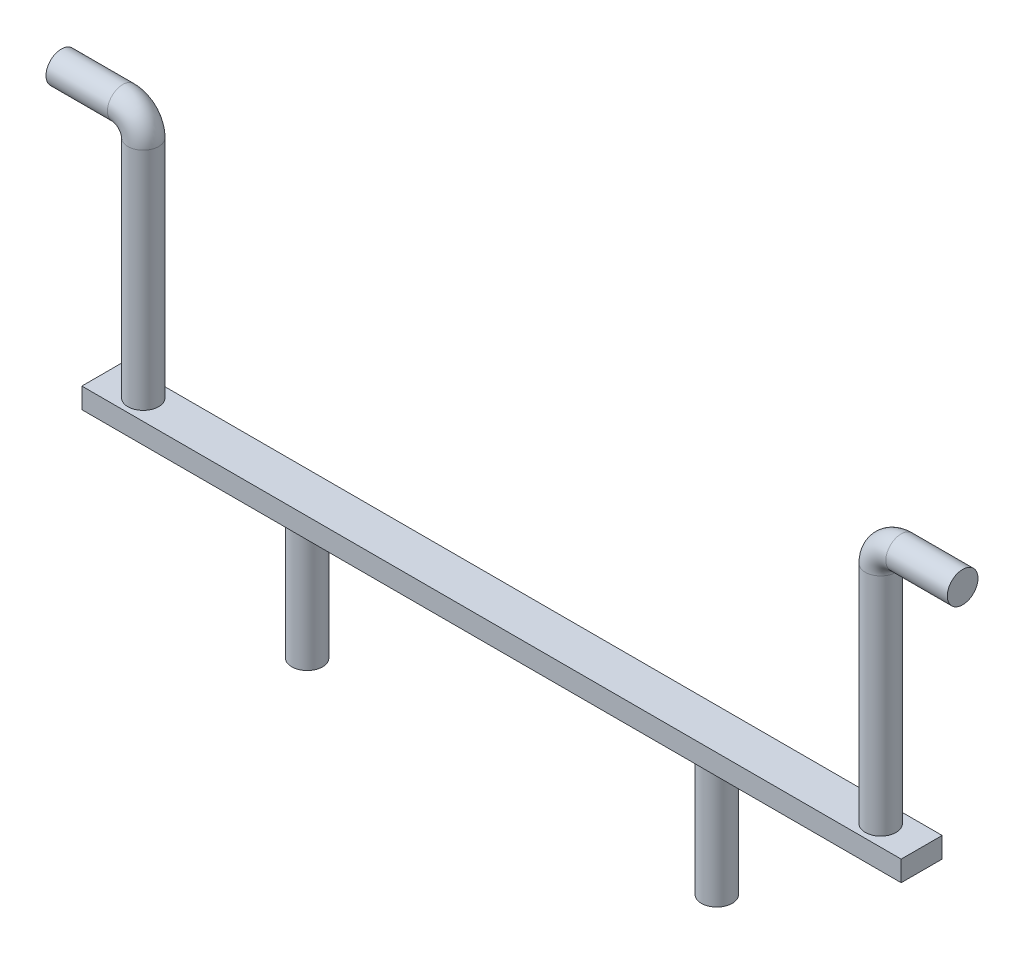
ISO-10303-21;
HEADER;
FILE_DESCRIPTION(('STEP AP214'),'2;1');
FILE_NAME('part.step','',(''),(''),'','','');
FILE_SCHEMA(('AUTOMOTIVE_DESIGN { 1 0 10303 214 1 1 1 1 }'));
ENDSEC;
DATA;
#1=APPLICATION_CONTEXT('core data for automotive mechanical design processes');
#2=APPLICATION_PROTOCOL_DEFINITION('international standard','automotive_design',2000,#1);
#3=PRODUCT_CONTEXT('',#1,'mechanical');
#4=PRODUCT('Part','Part','',(#3));
#5=PRODUCT_RELATED_PRODUCT_CATEGORY('part','',(#4));
#6=PRODUCT_DEFINITION_FORMATION('','',#4);
#7=PRODUCT_DEFINITION_CONTEXT('part definition',#1,'design');
#8=PRODUCT_DEFINITION('design','',#6,#7);
#9=PRODUCT_DEFINITION_SHAPE('','',#8);
#10=(LENGTH_UNIT() NAMED_UNIT(*) SI_UNIT(.MILLI.,.METRE.));
#11=(NAMED_UNIT(*) PLANE_ANGLE_UNIT() SI_UNIT($,.RADIAN.));
#12=(NAMED_UNIT(*) SI_UNIT($,.STERADIAN.) SOLID_ANGLE_UNIT());
#13=UNCERTAINTY_MEASURE_WITH_UNIT(LENGTH_MEASURE(1.E-05),#10,'distance_accuracy_value','');
#14=(GEOMETRIC_REPRESENTATION_CONTEXT(3) GLOBAL_UNCERTAINTY_ASSIGNED_CONTEXT((#13)) GLOBAL_UNIT_ASSIGNED_CONTEXT((#10,
#11,#12)) REPRESENTATION_CONTEXT('',''));
#15=CARTESIAN_POINT('',(0.,0.,0.));
#16=DIRECTION('',(0.,0.,1.));
#17=DIRECTION('',(1.,0.,0.));
#18=AXIS2_PLACEMENT_3D('',#15,#16,#17);
#19=CARTESIAN_POINT('',(254.,12.7,-12.7));
#20=DIRECTION('',(-1.,0.,0.));
#21=DIRECTION('',(0.,0.,1.));
#22=AXIS2_PLACEMENT_3D('',#19,#20,#21);
#23=PLANE('',#22);
#24=DIRECTION('',(0.,0.,-1.));
#25=VECTOR('',#24,1.);
#26=CARTESIAN_POINT('',(254.,0.,-12.7));
#27=LINE('',#26,#25);
#28=CARTESIAN_POINT('',(254.,0.,12.7));
#29=VERTEX_POINT('',#28);
#30=CARTESIAN_POINT('',(254.,0.,-12.7));
#31=VERTEX_POINT('',#30);
#32=EDGE_CURVE('E135',#29,#31,#27,.T.);
#33=ORIENTED_EDGE('',*,*,#32,.T.);
#34=DIRECTION('',(0.,-1.,0.));
#35=VECTOR('',#34,1.);
#36=CARTESIAN_POINT('',(254.,12.7,-12.7));
#37=LINE('',#36,#35);
#38=CARTESIAN_POINT('',(254.,12.7,-12.7));
#39=VERTEX_POINT('',#38);
#40=EDGE_CURVE('E124',#39,#31,#37,.T.);
#41=ORIENTED_EDGE('',*,*,#40,.F.);
#42=DIRECTION('',(0.,0.,-1.));
#43=VECTOR('',#42,1.);
#44=CARTESIAN_POINT('',(254.,12.7,-12.7));
#45=LINE('',#44,#43);
#46=CARTESIAN_POINT('',(254.,12.7,12.7));
#47=VERTEX_POINT('',#46);
#48=EDGE_CURVE('E116',#47,#39,#45,.T.);
#49=ORIENTED_EDGE('',*,*,#48,.F.);
#50=DIRECTION('',(0.,-1.,0.));
#51=VECTOR('',#50,1.);
#52=CARTESIAN_POINT('',(254.,12.7,12.7));
#53=LINE('',#52,#51);
#54=EDGE_CURVE('E131',#47,#29,#53,.T.);
#55=ORIENTED_EDGE('',*,*,#54,.T.);
#56=EDGE_LOOP('',(#33,#41,#49,#55));
#57=FACE_BOUND('',#56,.T.);
#58=ADVANCED_FACE('F63',(#57),#23,.F.);
#59=CARTESIAN_POINT('',(-254.,12.7,-12.7));
#60=DIRECTION('',(0.,0.,1.));
#61=DIRECTION('',(1.,0.,0.));
#62=AXIS2_PLACEMENT_3D('',#59,#60,#61);
#63=PLANE('',#62);
#64=DIRECTION('',(-1.,0.,0.));
#65=VECTOR('',#64,1.);
#66=CARTESIAN_POINT('',(-254.,0.,-12.7));
#67=LINE('',#66,#65);
#68=CARTESIAN_POINT('',(-254.,0.,-12.7));
#69=VERTEX_POINT('',#68);
#70=EDGE_CURVE('E122',#31,#69,#67,.T.);
#71=ORIENTED_EDGE('',*,*,#70,.T.);
#72=DIRECTION('',(0.,-1.,0.));
#73=VECTOR('',#72,1.);
#74=CARTESIAN_POINT('',(-254.,12.7,-12.7));
#75=LINE('',#74,#73);
#76=CARTESIAN_POINT('',(-254.,12.7,-12.7));
#77=VERTEX_POINT('',#76);
#78=EDGE_CURVE('E120',#77,#69,#75,.T.);
#79=ORIENTED_EDGE('',*,*,#78,.F.);
#80=DIRECTION('',(-1.,0.,0.));
#81=VECTOR('',#80,1.);
#82=CARTESIAN_POINT('',(-254.,12.7,-12.7));
#83=LINE('',#82,#81);
#84=EDGE_CURVE('E111',#39,#77,#83,.T.);
#85=ORIENTED_EDGE('',*,*,#84,.F.);
#86=ORIENTED_EDGE('',*,*,#40,.T.);
#87=EDGE_LOOP('',(#71,#79,#85,#86));
#88=FACE_BOUND('',#87,.T.);
#89=ADVANCED_FACE('F121',(#88),#63,.F.);
#90=CARTESIAN_POINT('',(-254.,12.7,-12.7));
#91=DIRECTION('',(1.,0.,0.));
#92=DIRECTION('',(0.,0.,-1.));
#93=AXIS2_PLACEMENT_3D('',#90,#91,#92);
#94=PLANE('',#93);
#95=DIRECTION('',(0.,0.,1.));
#96=VECTOR('',#95,1.);
#97=CARTESIAN_POINT('',(-254.,0.,-12.7));
#98=LINE('',#97,#96);
#99=CARTESIAN_POINT('',(-254.,0.,12.7));
#100=VERTEX_POINT('',#99);
#101=EDGE_CURVE('E97',#69,#100,#98,.T.);
#102=ORIENTED_EDGE('',*,*,#101,.T.);
#103=DIRECTION('',(0.,-1.,0.));
#104=VECTOR('',#103,1.);
#105=CARTESIAN_POINT('',(-254.,12.7,12.7));
#106=LINE('',#105,#104);
#107=CARTESIAN_POINT('',(-254.,12.7,12.7));
#108=VERTEX_POINT('',#107);
#109=EDGE_CURVE('E125',#108,#100,#106,.T.);
#110=ORIENTED_EDGE('',*,*,#109,.F.);
#111=DIRECTION('',(0.,0.,1.));
#112=VECTOR('',#111,1.);
#113=CARTESIAN_POINT('',(-254.,12.7,-12.7));
#114=LINE('',#113,#112);
#115=EDGE_CURVE('E114',#77,#108,#114,.T.);
#116=ORIENTED_EDGE('',*,*,#115,.F.);
#117=ORIENTED_EDGE('',*,*,#78,.T.);
#118=EDGE_LOOP('',(#102,#110,#116,#117));
#119=FACE_BOUND('',#118,.T.);
#120=ADVANCED_FACE('F127',(#119),#94,.F.);
#121=CARTESIAN_POINT('',(-254.,12.7,12.7));
#122=DIRECTION('',(0.,0.,-1.));
#123=DIRECTION('',(-1.,0.,0.));
#124=AXIS2_PLACEMENT_3D('',#121,#122,#123);
#125=PLANE('',#124);
#126=DIRECTION('',(1.,0.,0.));
#127=VECTOR('',#126,1.);
#128=CARTESIAN_POINT('',(-254.,0.,12.7));
#129=LINE('',#128,#127);
#130=EDGE_CURVE('E103',#100,#29,#129,.T.);
#131=ORIENTED_EDGE('',*,*,#130,.T.);
#132=ORIENTED_EDGE('',*,*,#54,.F.);
#133=DIRECTION('',(1.,0.,0.));
#134=VECTOR('',#133,1.);
#135=CARTESIAN_POINT('',(-254.,12.7,12.7));
#136=LINE('',#135,#134);
#137=EDGE_CURVE('E80',#108,#47,#136,.T.);
#138=ORIENTED_EDGE('',*,*,#137,.F.);
#139=ORIENTED_EDGE('',*,*,#109,.T.);
#140=EDGE_LOOP('',(#131,#132,#138,#139));
#141=FACE_BOUND('',#140,.T.);
#142=ADVANCED_FACE('F164',(#141),#125,.F.);
#143=CARTESIAN_POINT('',(0.,12.7,0.));
#144=DIRECTION('',(0.,1.,0.));
#145=DIRECTION('',(0.,0.,1.));
#146=AXIS2_PLACEMENT_3D('',#143,#144,#145);
#147=PLANE('',#146);
#148=CARTESIAN_POINT('',(228.6,12.7,0.));
#149=DIRECTION('',(0.,1.,0.));
#150=DIRECTION('',(0.,0.,-1.));
#151=AXIS2_PLACEMENT_3D('',#148,#149,#150);
#152=CIRCLE('',#151,9.525);
#153=CARTESIAN_POINT('',(228.6,12.7,-9.525));
#154=VERTEX_POINT('',#153);
#155=EDGE_CURVE('E338',#154,#154,#152,.F.);
#156=ORIENTED_EDGE('',*,*,#155,.T.);
#157=EDGE_LOOP('',(#156));
#158=FACE_BOUND('',#157,.T.);
#159=CARTESIAN_POINT('',(-228.6,12.7,0.));
#160=DIRECTION('',(0.,-1.,0.));
#161=DIRECTION('',(0.,0.,-1.));
#162=AXIS2_PLACEMENT_3D('',#159,#160,#161);
#163=CIRCLE('',#162,9.525);
#164=CARTESIAN_POINT('',(-228.6,12.7,-9.525));
#165=VERTEX_POINT('',#164);
#166=EDGE_CURVE('E335',#165,#165,#163,.T.);
#167=ORIENTED_EDGE('',*,*,#166,.T.);
#168=EDGE_LOOP('',(#167));
#169=FACE_BOUND('',#168,.T.);
#170=ORIENTED_EDGE('',*,*,#48,.T.);
#171=ORIENTED_EDGE('',*,*,#84,.T.);
#172=ORIENTED_EDGE('',*,*,#115,.T.);
#173=ORIENTED_EDGE('',*,*,#137,.T.);
#174=EDGE_LOOP('',(#170,#171,#172,#173));
#175=FACE_BOUND('',#174,.T.);
#176=ADVANCED_FACE('F112',(#158,#169,#175),#147,.T.);
#177=CARTESIAN_POINT('',(0.,0.,0.));
#178=DIRECTION('',(0.,1.,0.));
#179=DIRECTION('',(0.,0.,1.));
#180=AXIS2_PLACEMENT_3D('',#177,#178,#179);
#181=PLANE('',#180);
#182=CARTESIAN_POINT('',(127.,0.,0.));
#183=DIRECTION('',(0.,1.,0.));
#184=DIRECTION('',(0.,0.,1.));
#185=AXIS2_PLACEMENT_3D('',#182,#183,#184);
#186=CIRCLE('',#185,9.52500000000001);
#187=CARTESIAN_POINT('',(127.,0.,9.52500000000001));
#188=VERTEX_POINT('',#187);
#189=EDGE_CURVE('E12',#188,#188,#186,.F.);
#190=ORIENTED_EDGE('',*,*,#189,.F.);
#191=EDGE_LOOP('',(#190));
#192=FACE_BOUND('',#191,.T.);
#193=CARTESIAN_POINT('',(-127.,0.,0.));
#194=DIRECTION('',(0.,1.,0.));
#195=DIRECTION('',(0.,0.,1.));
#196=AXIS2_PLACEMENT_3D('',#193,#194,#195);
#197=CIRCLE('',#196,9.52500000000001);
#198=CARTESIAN_POINT('',(-127.,0.,9.52500000000001));
#199=VERTEX_POINT('',#198);
#200=EDGE_CURVE('E72',#199,#199,#197,.F.);
#201=ORIENTED_EDGE('',*,*,#200,.F.);
#202=EDGE_LOOP('',(#201));
#203=FACE_BOUND('',#202,.T.);
#204=ORIENTED_EDGE('',*,*,#32,.F.);
#205=ORIENTED_EDGE('',*,*,#130,.F.);
#206=ORIENTED_EDGE('',*,*,#101,.F.);
#207=ORIENTED_EDGE('',*,*,#70,.F.);
#208=EDGE_LOOP('',(#204,#205,#206,#207));
#209=FACE_BOUND('',#208,.T.);
#210=ADVANCED_FACE('F157',(#192,#203,#209),#181,.F.);
#211=CARTESIAN_POINT('',(-127.,-76.2,0.));
#212=DIRECTION('',(0.,1.,0.));
#213=DIRECTION('',(0.,0.,1.));
#214=AXIS2_PLACEMENT_3D('',#211,#212,#213);
#215=CYLINDRICAL_SURFACE('',#214,9.52500000000001);
#216=CARTESIAN_POINT('',(-127.,-76.2,0.));
#217=DIRECTION('',(0.,-1.,0.));
#218=DIRECTION('',(0.,0.,-1.));
#219=AXIS2_PLACEMENT_3D('',#216,#217,#218);
#220=CIRCLE('',#219,9.52500000000001);
#221=CARTESIAN_POINT('',(-127.,-76.2,9.52500000000001));
#222=VERTEX_POINT('',#221);
#223=EDGE_CURVE('E139',#222,#222,#220,.T.);
#224=CARTESIAN_POINT('',(-127.,-76.2,9.52500000000001));
#225=CARTESIAN_POINT('',(-127.,-75.40625,9.52500000000001));
#226=CARTESIAN_POINT('',(-127.,-74.6125,9.52500000000001));
#227=CARTESIAN_POINT('',(-127.,-73.025,9.52500000000001));
#228=CARTESIAN_POINT('',(-127.,-72.23125,9.52500000000001));
#229=CARTESIAN_POINT('',(-127.,-70.64375,9.52500000000001));
#230=CARTESIAN_POINT('',(-127.,-69.85,9.52500000000001));
#231=CARTESIAN_POINT('',(-127.,-68.2625,9.52500000000001));
#232=CARTESIAN_POINT('',(-127.,-67.46875,9.52500000000001));
#233=CARTESIAN_POINT('',(-127.,-65.88125,9.52500000000001));
#234=CARTESIAN_POINT('',(-127.,-65.0875,9.52500000000001));
#235=CARTESIAN_POINT('',(-127.,-63.5,9.52500000000001));
#236=CARTESIAN_POINT('',(-127.,-62.70625,9.52500000000001));
#237=CARTESIAN_POINT('',(-127.,-61.11875,9.52500000000001));
#238=CARTESIAN_POINT('',(-127.,-60.325,9.52500000000001));
#239=CARTESIAN_POINT('',(-127.,-58.7375,9.52500000000001));
#240=CARTESIAN_POINT('',(-127.,-57.94375,9.52500000000001));
#241=CARTESIAN_POINT('',(-127.,-56.35625,9.52500000000001));
#242=CARTESIAN_POINT('',(-127.,-55.5625,9.52500000000001));
#243=CARTESIAN_POINT('',(-127.,-53.975,9.52500000000001));
#244=CARTESIAN_POINT('',(-127.,-53.18125,9.52500000000001));
#245=CARTESIAN_POINT('',(-127.,-51.59375,9.52500000000001));
#246=CARTESIAN_POINT('',(-127.,-50.8,9.52500000000001));
#247=CARTESIAN_POINT('',(-127.,-49.2125,9.52500000000001));
#248=CARTESIAN_POINT('',(-127.,-48.41875,9.52500000000001));
#249=CARTESIAN_POINT('',(-127.,-46.83125,9.52500000000001));
#250=CARTESIAN_POINT('',(-127.,-46.0375,9.52500000000001));
#251=CARTESIAN_POINT('',(-127.,-44.45,9.52500000000001));
#252=CARTESIAN_POINT('',(-127.,-43.65625,9.52500000000001));
#253=CARTESIAN_POINT('',(-127.,-42.06875,9.52500000000001));
#254=CARTESIAN_POINT('',(-127.,-41.275,9.52500000000001));
#255=CARTESIAN_POINT('',(-127.,-39.6875,9.52500000000001));
#256=CARTESIAN_POINT('',(-127.,-38.89375,9.52500000000001));
#257=CARTESIAN_POINT('',(-127.,-37.30625,9.52500000000001));
#258=CARTESIAN_POINT('',(-127.,-36.5125,9.52500000000001));
#259=CARTESIAN_POINT('',(-127.,-34.925,9.52500000000001));
#260=CARTESIAN_POINT('',(-127.,-34.13125,9.52500000000001));
#261=CARTESIAN_POINT('',(-127.,-32.54375,9.52500000000001));
#262=CARTESIAN_POINT('',(-127.,-31.75,9.52500000000001));
#263=CARTESIAN_POINT('',(-127.,-30.1625,9.52500000000001));
#264=CARTESIAN_POINT('',(-127.,-29.36875,9.52500000000001));
#265=CARTESIAN_POINT('',(-127.,-27.78125,9.52500000000001));
#266=CARTESIAN_POINT('',(-127.,-26.9875,9.52500000000001));
#267=CARTESIAN_POINT('',(-127.,-25.4,9.52500000000001));
#268=CARTESIAN_POINT('',(-127.,-24.60625,9.52500000000001));
#269=CARTESIAN_POINT('',(-127.,-23.01875,9.52500000000001));
#270=CARTESIAN_POINT('',(-127.,-22.225,9.52500000000001));
#271=CARTESIAN_POINT('',(-127.,-20.6375,9.52500000000001));
#272=CARTESIAN_POINT('',(-127.,-19.84375,9.52500000000001));
#273=CARTESIAN_POINT('',(-127.,-18.25625,9.52500000000001));
#274=CARTESIAN_POINT('',(-127.,-17.4625,9.52500000000001));
#275=CARTESIAN_POINT('',(-127.,-15.875,9.52500000000001));
#276=CARTESIAN_POINT('',(-127.,-15.08125,9.52500000000001));
#277=CARTESIAN_POINT('',(-127.,-13.49375,9.52500000000001));
#278=CARTESIAN_POINT('',(-127.,-12.7,9.52500000000001));
#279=CARTESIAN_POINT('',(-127.,-11.1125,9.52500000000001));
#280=CARTESIAN_POINT('',(-127.,-10.31875,9.52500000000001));
#281=CARTESIAN_POINT('',(-127.,-8.73125,9.52500000000001));
#282=CARTESIAN_POINT('',(-127.,-7.93750000000001,9.52500000000001));
#283=CARTESIAN_POINT('',(-127.,-6.35,9.52500000000001));
#284=CARTESIAN_POINT('',(-127.,-5.55625,9.52500000000001));
#285=CARTESIAN_POINT('',(-127.,-3.96875,9.52500000000001));
#286=CARTESIAN_POINT('',(-127.,-3.175,9.52500000000001));
#287=CARTESIAN_POINT('',(-127.,-1.5875,9.52500000000001));
#288=CARTESIAN_POINT('',(-127.,-0.793750000000001,9.52500000000001));
#289=CARTESIAN_POINT('',(-127.,0.,9.52500000000001));
#290=B_SPLINE_CURVE_WITH_KNOTS('',3,(#224,#225,#226,#227,#228,#229,#230,#231,#232,#233,#234,
#235,#236,#237,#238,#239,#240,#241,#242,#243,#244,#245,#246,#247,#248,#249,#250,#251,#252,#253,
#254,#255,#256,#257,#258,#259,#260,#261,#262,#263,#264,#265,#266,#267,#268,#269,#270,#271,#272,
#273,#274,#275,#276,#277,#278,#279,#280,#281,#282,#283,#284,#285,#286,#287,#288,#289),
.UNSPECIFIED.,.F.,.F.,(4,2,2,2,2,2,2,2,2,2,2,2,2,2,2,2,2,2,2,2,2,2,2,2,2,2,2,2,2,2,2,2,4),(0.,
2.38125,4.7625,7.14375,9.52500000000001,11.90625,14.2875,16.66875,19.05,21.43125,23.8125,
26.19375,28.575,30.95625,33.3375,35.71875,38.1,40.48125,42.8625,45.24375,47.625,50.00625,
52.3875,54.76875,57.15,59.53125,61.9125,64.29375,66.675,69.05625,71.4375,73.81875,76.2),.UNSPECIFIED.);
#291=EDGE_CURVE('BSEAM155',#222,#199,#290,.T.);
#292=ORIENTED_EDGE('',*,*,#223,.F.);
#293=ORIENTED_EDGE('',*,*,#200,.T.);
#294=ORIENTED_EDGE('',*,*,#291,.T.);
#295=ORIENTED_EDGE('',*,*,#291,.F.);
#296=EDGE_LOOP('',(#292,#294,#293,#295));
#297=FACE_BOUND('',#296,.T.);
#298=ADVANCED_FACE('F155',(#297),#215,.T.);
#299=CARTESIAN_POINT('',(-127.,-76.2,0.));
#300=DIRECTION('',(0.,-1.,0.));
#301=DIRECTION('',(0.,0.,-1.));
#302=AXIS2_PLACEMENT_3D('',#299,#300,#301);
#303=PLANE('',#302);
#304=ORIENTED_EDGE('',*,*,#223,.T.);
#305=EDGE_LOOP('',(#304));
#306=FACE_BOUND('',#305,.T.);
#307=ADVANCED_FACE('F204',(#306),#303,.T.);
#308=CARTESIAN_POINT('',(127.,-76.2,0.));
#309=DIRECTION('',(0.,1.,0.));
#310=DIRECTION('',(0.,0.,1.));
#311=AXIS2_PLACEMENT_3D('',#308,#309,#310);
#312=CYLINDRICAL_SURFACE('',#311,9.52500000000001);
#313=CARTESIAN_POINT('',(127.,-76.2,0.));
#314=DIRECTION('',(0.,-1.,0.));
#315=DIRECTION('',(0.,0.,1.));
#316=AXIS2_PLACEMENT_3D('',#313,#314,#315);
#317=CIRCLE('',#316,9.52500000000001);
#318=CARTESIAN_POINT('',(127.,-76.2,9.52500000000001));
#319=VERTEX_POINT('',#318);
#320=EDGE_CURVE('E357',#319,#319,#317,.T.);
#321=CARTESIAN_POINT('',(127.,-76.2,9.52500000000001));
#322=CARTESIAN_POINT('',(127.,-75.40625,9.52500000000001));
#323=CARTESIAN_POINT('',(127.,-74.6125,9.52500000000001));
#324=CARTESIAN_POINT('',(127.,-73.025,9.52500000000001));
#325=CARTESIAN_POINT('',(127.,-72.23125,9.52500000000001));
#326=CARTESIAN_POINT('',(127.,-70.64375,9.52500000000001));
#327=CARTESIAN_POINT('',(127.,-69.85,9.52500000000001));
#328=CARTESIAN_POINT('',(127.,-68.2625,9.52500000000001));
#329=CARTESIAN_POINT('',(127.,-67.46875,9.52500000000001));
#330=CARTESIAN_POINT('',(127.,-65.88125,9.52500000000001));
#331=CARTESIAN_POINT('',(127.,-65.0875,9.52500000000001));
#332=CARTESIAN_POINT('',(127.,-63.5,9.52500000000001));
#333=CARTESIAN_POINT('',(127.,-62.70625,9.52500000000001));
#334=CARTESIAN_POINT('',(127.,-61.11875,9.52500000000001));
#335=CARTESIAN_POINT('',(127.,-60.325,9.52500000000001));
#336=CARTESIAN_POINT('',(127.,-58.7375,9.52500000000001));
#337=CARTESIAN_POINT('',(127.,-57.94375,9.52500000000001));
#338=CARTESIAN_POINT('',(127.,-56.35625,9.52500000000001));
#339=CARTESIAN_POINT('',(127.,-55.5625,9.52500000000001));
#340=CARTESIAN_POINT('',(127.,-53.975,9.52500000000001));
#341=CARTESIAN_POINT('',(127.,-53.18125,9.52500000000001));
#342=CARTESIAN_POINT('',(127.,-51.59375,9.52500000000001));
#343=CARTESIAN_POINT('',(127.,-50.8,9.52500000000001));
#344=CARTESIAN_POINT('',(127.,-49.2125,9.52500000000001));
#345=CARTESIAN_POINT('',(127.,-48.41875,9.52500000000001));
#346=CARTESIAN_POINT('',(127.,-46.83125,9.52500000000001));
#347=CARTESIAN_POINT('',(127.,-46.0375,9.52500000000001));
#348=CARTESIAN_POINT('',(127.,-44.45,9.52500000000001));
#349=CARTESIAN_POINT('',(127.,-43.65625,9.52500000000001));
#350=CARTESIAN_POINT('',(127.,-42.06875,9.52500000000001));
#351=CARTESIAN_POINT('',(127.,-41.275,9.52500000000001));
#352=CARTESIAN_POINT('',(127.,-39.6875,9.52500000000001));
#353=CARTESIAN_POINT('',(127.,-38.89375,9.52500000000001));
#354=CARTESIAN_POINT('',(127.,-37.30625,9.52500000000001));
#355=CARTESIAN_POINT('',(127.,-36.5125,9.52500000000001));
#356=CARTESIAN_POINT('',(127.,-34.925,9.52500000000001));
#357=CARTESIAN_POINT('',(127.,-34.13125,9.52500000000001));
#358=CARTESIAN_POINT('',(127.,-32.54375,9.52500000000001));
#359=CARTESIAN_POINT('',(127.,-31.75,9.52500000000001));
#360=CARTESIAN_POINT('',(127.,-30.1625,9.52500000000001));
#361=CARTESIAN_POINT('',(127.,-29.36875,9.52500000000001));
#362=CARTESIAN_POINT('',(127.,-27.78125,9.52500000000001));
#363=CARTESIAN_POINT('',(127.,-26.9875,9.52500000000001));
#364=CARTESIAN_POINT('',(127.,-25.4,9.52500000000001));
#365=CARTESIAN_POINT('',(127.,-24.60625,9.52500000000001));
#366=CARTESIAN_POINT('',(127.,-23.01875,9.52500000000001));
#367=CARTESIAN_POINT('',(127.,-22.225,9.52500000000001));
#368=CARTESIAN_POINT('',(127.,-20.6375,9.52500000000001));
#369=CARTESIAN_POINT('',(127.,-19.84375,9.52500000000001));
#370=CARTESIAN_POINT('',(127.,-18.25625,9.52500000000001));
#371=CARTESIAN_POINT('',(127.,-17.4625,9.52500000000001));
#372=CARTESIAN_POINT('',(127.,-15.875,9.52500000000001));
#373=CARTESIAN_POINT('',(127.,-15.08125,9.52500000000001));
#374=CARTESIAN_POINT('',(127.,-13.49375,9.52500000000001));
#375=CARTESIAN_POINT('',(127.,-12.7,9.52500000000001));
#376=CARTESIAN_POINT('',(127.,-11.1125,9.52500000000001));
#377=CARTESIAN_POINT('',(127.,-10.31875,9.52500000000001));
#378=CARTESIAN_POINT('',(127.,-8.73125,9.52500000000001));
#379=CARTESIAN_POINT('',(127.,-7.93750000000001,9.52500000000001));
#380=CARTESIAN_POINT('',(127.,-6.35,9.52500000000001));
#381=CARTESIAN_POINT('',(127.,-5.55625,9.52500000000001));
#382=CARTESIAN_POINT('',(127.,-3.96875,9.52500000000001));
#383=CARTESIAN_POINT('',(127.,-3.175,9.52500000000001));
#384=CARTESIAN_POINT('',(127.,-1.5875,9.52500000000001));
#385=CARTESIAN_POINT('',(127.,-0.793750000000001,9.52500000000001));
#386=CARTESIAN_POINT('',(127.,0.,9.52500000000001));
#387=B_SPLINE_CURVE_WITH_KNOTS('',3,(#321,#322,#323,#324,#325,#326,#327,#328,#329,#330,#331,
#332,#333,#334,#335,#336,#337,#338,#339,#340,#341,#342,#343,#344,#345,#346,#347,#348,#349,#350,
#351,#352,#353,#354,#355,#356,#357,#358,#359,#360,#361,#362,#363,#364,#365,#366,#367,#368,#369,
#370,#371,#372,#373,#374,#375,#376,#377,#378,#379,#380,#381,#382,#383,#384,#385,#386),
.UNSPECIFIED.,.F.,.F.,(4,2,2,2,2,2,2,2,2,2,2,2,2,2,2,2,2,2,2,2,2,2,2,2,2,2,2,2,2,2,2,2,4),(0.,
2.38125,4.7625,7.14375,9.52500000000001,11.90625,14.2875,16.66875,19.05,21.43125,23.8125,
26.19375,28.575,30.95625,33.3375,35.71875,38.1,40.48125,42.8625,45.24375,47.625,50.00625,
52.3875,54.76875,57.15,59.53125,61.9125,64.29375,66.675,69.05625,71.4375,73.81875,76.2),.UNSPECIFIED.);
#388=EDGE_CURVE('BSEAM214',#319,#188,#387,.T.);
#389=ORIENTED_EDGE('',*,*,#320,.F.);
#390=ORIENTED_EDGE('',*,*,#189,.T.);
#391=ORIENTED_EDGE('',*,*,#388,.T.);
#392=ORIENTED_EDGE('',*,*,#388,.F.);
#393=EDGE_LOOP('',(#389,#391,#390,#392));
#394=FACE_BOUND('',#393,.T.);
#395=ADVANCED_FACE('F214',(#394),#312,.T.);
#396=CARTESIAN_POINT('',(127.,-76.2,0.));
#397=DIRECTION('',(0.,1.,0.));
#398=DIRECTION('',(0.,0.,1.));
#399=AXIS2_PLACEMENT_3D('',#396,#397,#398);
#400=PLANE('',#399);
#401=ORIENTED_EDGE('',*,*,#320,.T.);
#402=EDGE_LOOP('',(#401));
#403=FACE_BOUND('',#402,.T.);
#404=ADVANCED_FACE('F224',(#403),#400,.F.);
#405=CARTESIAN_POINT('',(-279.4,165.1,0.));
#406=DIRECTION('',(1.,0.,0.));
#407=DIRECTION('',(0.,0.,-1.));
#408=AXIS2_PLACEMENT_3D('',#405,#406,#407);
#409=PLANE('',#408);
#410=CARTESIAN_POINT('',(-279.4,165.1,0.));
#411=DIRECTION('',(1.,0.,0.));
#412=DIRECTION('',(0.,0.,-1.));
#413=AXIS2_PLACEMENT_3D('',#410,#411,#412);
#414=CIRCLE('',#413,9.525);
#415=CARTESIAN_POINT('',(-279.4,165.1,-9.525));
#416=VERTEX_POINT('',#415);
#417=EDGE_CURVE('E353',#416,#416,#414,.T.);
#418=ORIENTED_EDGE('',*,*,#417,.F.);
#419=EDGE_LOOP('',(#418));
#420=FACE_BOUND('',#419,.T.);
#421=ADVANCED_FACE('F234',(#420),#409,.F.);
#422=CARTESIAN_POINT('',(-228.6,12.7,0.));
#423=DIRECTION('',(0.,1.,0.));
#424=DIRECTION('',(0.,0.,1.));
#425=AXIS2_PLACEMENT_3D('',#422,#423,#424);
#426=CYLINDRICAL_SURFACE('',#425,9.525);
#427=CARTESIAN_POINT('',(-228.6,152.4,0.));
#428=DIRECTION('',(0.,-1.,0.));
#429=DIRECTION('',(0.,0.,-1.));
#430=AXIS2_PLACEMENT_3D('',#427,#428,#429);
#431=CIRCLE('',#430,9.525);
#432=CARTESIAN_POINT('',(-219.075,152.4,0.));
#433=VERTEX_POINT('',#432);
#434=EDGE_CURVE('E345',#433,#433,#431,.T.);
#435=ORIENTED_EDGE('',*,*,#434,.T.);
#436=EDGE_LOOP('',(#435));
#437=FACE_BOUND('',#436,.T.);
#438=ORIENTED_EDGE('',*,*,#166,.F.);
#439=EDGE_LOOP('',(#438));
#440=FACE_BOUND('',#439,.T.);
#441=ADVANCED_FACE('F245',(#437,#440),#426,.T.);
#442=CARTESIAN_POINT('',(-241.3,152.4,0.));
#443=DIRECTION('',(0.,0.,1.));
#444=DIRECTION('',(1.,0.,0.));
#445=AXIS2_PLACEMENT_3D('',#442,#443,#444);
#446=TOROIDAL_SURFACE('',#445,12.7,9.525);
#447=CARTESIAN_POINT('',(-241.299999999998,165.100000000002,0.));
#448=DIRECTION('',(1.,0.,0.));
#449=DIRECTION('',(0.,0.,-1.));
#450=AXIS2_PLACEMENT_3D('',#447,#448,#449);
#451=CIRCLE('',#450,9.525);
#452=CARTESIAN_POINT('',(-241.299999999997,174.625,0.));
#453=VERTEX_POINT('',#452);
#454=EDGE_CURVE('E349',#453,#453,#451,.T.);
#455=CARTESIAN_POINT('',(-241.3,152.4,0.));
#456=DIRECTION('',(0.,0.,1.));
#457=DIRECTION('',(1.,0.,0.));
#458=AXIS2_PLACEMENT_3D('',#455,#456,#457);
#459=CIRCLE('',#458,22.225);
#460=EDGE_CURVE('',#433,#453,#459,.T.);
#461=ORIENTED_EDGE('',*,*,#434,.F.);
#462=ORIENTED_EDGE('',*,*,#454,.T.);
#463=ORIENTED_EDGE('',*,*,#460,.T.);
#464=ORIENTED_EDGE('',*,*,#460,.F.);
#465=EDGE_LOOP('',(#461,#463,#462,#464));
#466=FACE_BOUND('',#465,.T.);
#467=ADVANCED_FACE('F256',(#466),#446,.T.);
#468=CARTESIAN_POINT('',(-241.3,165.1,0.));
#469=DIRECTION('',(-1.,0.,0.));
#470=DIRECTION('',(0.,0.,1.));
#471=AXIS2_PLACEMENT_3D('',#468,#469,#470);
#472=CYLINDRICAL_SURFACE('',#471,9.525);
#473=ORIENTED_EDGE('',*,*,#417,.T.);
#474=EDGE_LOOP('',(#473));
#475=FACE_BOUND('',#474,.T.);
#476=ORIENTED_EDGE('',*,*,#454,.F.);
#477=EDGE_LOOP('',(#476));
#478=FACE_BOUND('',#477,.T.);
#479=ADVANCED_FACE('F237',(#475,#478),#472,.T.);
#480=CARTESIAN_POINT('',(279.4,165.1,0.));
#481=DIRECTION('',(-1.,0.,0.));
#482=DIRECTION('',(0.,0.,-1.));
#483=AXIS2_PLACEMENT_3D('',#480,#481,#482);
#484=PLANE('',#483);
#485=CARTESIAN_POINT('',(279.4,165.1,0.));
#486=DIRECTION('',(1.,0.,0.));
#487=DIRECTION('',(0.,0.,-1.));
#488=AXIS2_PLACEMENT_3D('',#485,#486,#487);
#489=CIRCLE('',#488,9.525);
#490=CARTESIAN_POINT('',(279.4,165.1,-9.525));
#491=VERTEX_POINT('',#490);
#492=EDGE_CURVE('E326',#491,#491,#489,.F.);
#493=ORIENTED_EDGE('',*,*,#492,.F.);
#494=EDGE_LOOP('',(#493));
#495=FACE_BOUND('',#494,.T.);
#496=ADVANCED_FACE('F275',(#495),#484,.F.);
#497=CARTESIAN_POINT('',(228.6,12.7,0.));
#498=DIRECTION('',(0.,1.,0.));
#499=DIRECTION('',(0.,0.,1.));
#500=AXIS2_PLACEMENT_3D('',#497,#498,#499);
#501=CYLINDRICAL_SURFACE('',#500,9.525);
#502=CARTESIAN_POINT('',(228.6,152.4,0.));
#503=DIRECTION('',(0.,1.,0.));
#504=DIRECTION('',(0.,0.,-1.));
#505=AXIS2_PLACEMENT_3D('',#502,#503,#504);
#506=CIRCLE('',#505,9.525);
#507=CARTESIAN_POINT('',(219.075,152.4,0.));
#508=VERTEX_POINT('',#507);
#509=EDGE_CURVE('E331',#508,#508,#506,.F.);
#510=ORIENTED_EDGE('',*,*,#509,.T.);
#511=EDGE_LOOP('',(#510));
#512=FACE_BOUND('',#511,.T.);
#513=ORIENTED_EDGE('',*,*,#155,.F.);
#514=EDGE_LOOP('',(#513));
#515=FACE_BOUND('',#514,.T.);
#516=ADVANCED_FACE('F290',(#512,#515),#501,.T.);
#517=CARTESIAN_POINT('',(241.3,152.4,0.));
#518=DIRECTION('',(0.,0.,-1.));
#519=DIRECTION('',(-1.,0.,0.));
#520=AXIS2_PLACEMENT_3D('',#517,#518,#519);
#521=TOROIDAL_SURFACE('',#520,12.7,9.525);
#522=CARTESIAN_POINT('',(241.299999999998,165.100000000002,0.));
#523=DIRECTION('',(1.,0.,0.));
#524=DIRECTION('',(0.,0.,-1.));
#525=AXIS2_PLACEMENT_3D('',#522,#523,#524);
#526=CIRCLE('',#525,9.525);
#527=CARTESIAN_POINT('',(241.299999999997,174.625,0.));
#528=VERTEX_POINT('',#527);
#529=EDGE_CURVE('E329',#528,#528,#526,.F.);
#530=CARTESIAN_POINT('',(241.3,152.4,0.));
#531=DIRECTION('',(0.,0.,-1.));
#532=DIRECTION('',(-1.,0.,0.));
#533=AXIS2_PLACEMENT_3D('',#530,#531,#532);
#534=CIRCLE('',#533,22.225);
#535=EDGE_CURVE('',#508,#528,#534,.T.);
#536=ORIENTED_EDGE('',*,*,#509,.F.);
#537=ORIENTED_EDGE('',*,*,#529,.T.);
#538=ORIENTED_EDGE('',*,*,#535,.T.);
#539=ORIENTED_EDGE('',*,*,#535,.F.);
#540=EDGE_LOOP('',(#536,#538,#537,#539));
#541=FACE_BOUND('',#540,.T.);
#542=ADVANCED_FACE('F300',(#541),#521,.T.);
#543=CARTESIAN_POINT('',(241.3,165.1,0.));
#544=DIRECTION('',(1.,0.,0.));
#545=DIRECTION('',(0.,0.,-1.));
#546=AXIS2_PLACEMENT_3D('',#543,#544,#545);
#547=CYLINDRICAL_SURFACE('',#546,9.525);
#548=ORIENTED_EDGE('',*,*,#492,.T.);
#549=EDGE_LOOP('',(#548));
#550=FACE_BOUND('',#549,.T.);
#551=ORIENTED_EDGE('',*,*,#529,.F.);
#552=EDGE_LOOP('',(#551));
#553=FACE_BOUND('',#552,.T.);
#554=ADVANCED_FACE('F248',(#550,#553),#547,.T.);
#555=CLOSED_SHELL('',(#58,#89,#120,#142,#176,#210,#298,#307,#395,#404,#421,#441,#467,#479,#496,
#516,#542,#554));
#556=MANIFOLD_SOLID_BREP('B2',#555);
#557=ADVANCED_BREP_SHAPE_REPRESENTATION('',(#18,#556),#14);
#558=SHAPE_DEFINITION_REPRESENTATION(#9,#557);
ENDSEC;
END-ISO-10303-21;
